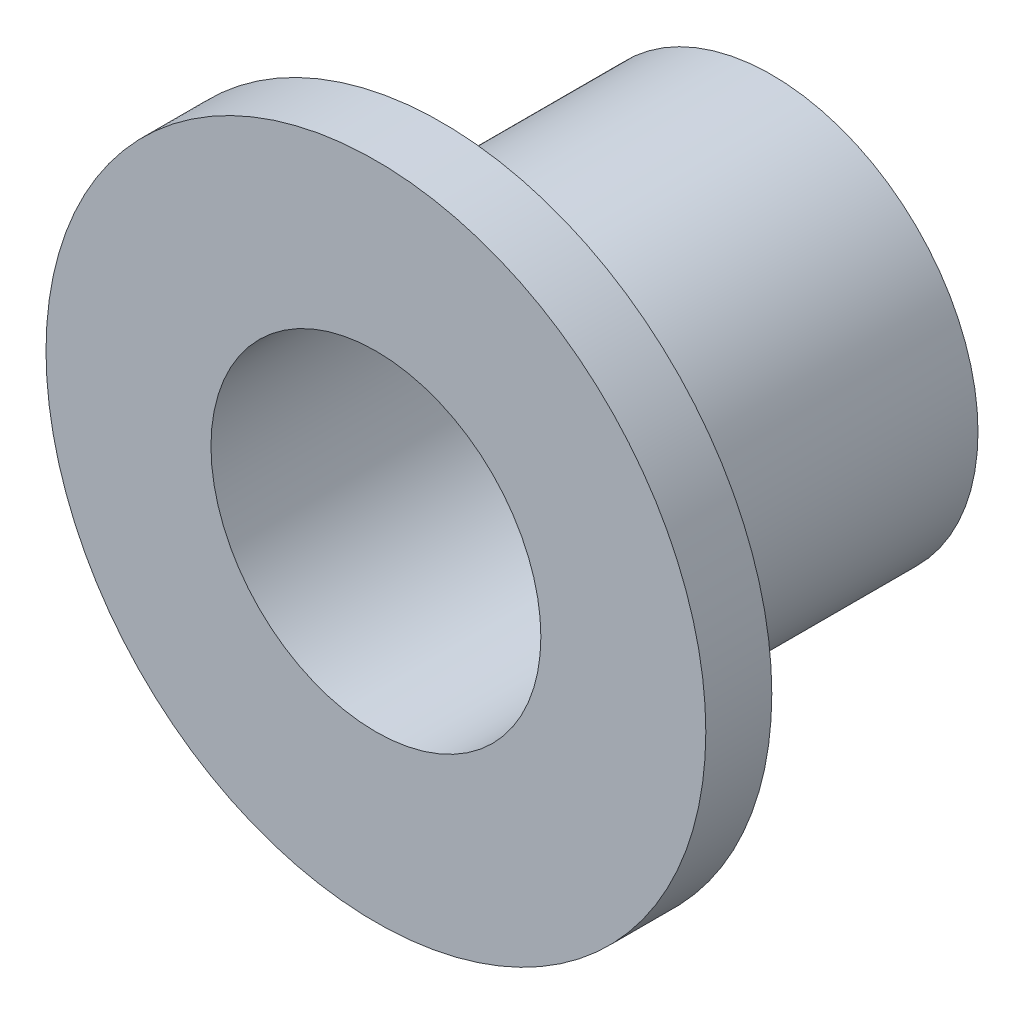
ISO-10303-21;
HEADER;
FILE_DESCRIPTION(('STEP AP214'),'2;1');
FILE_NAME('part.step','',(''),(''),'','','');
FILE_SCHEMA(('AUTOMOTIVE_DESIGN { 1 0 10303 214 1 1 1 1 }'));
ENDSEC;
DATA;
#1=APPLICATION_CONTEXT('core data for automotive mechanical design processes');
#2=APPLICATION_PROTOCOL_DEFINITION('international standard','automotive_design',2000,#1);
#3=PRODUCT_CONTEXT('',#1,'mechanical');
#4=PRODUCT('Part','Part','',(#3));
#5=PRODUCT_RELATED_PRODUCT_CATEGORY('part','',(#4));
#6=PRODUCT_DEFINITION_FORMATION('','',#4);
#7=PRODUCT_DEFINITION_CONTEXT('part definition',#1,'design');
#8=PRODUCT_DEFINITION('design','',#6,#7);
#9=PRODUCT_DEFINITION_SHAPE('','',#8);
#10=(LENGTH_UNIT() NAMED_UNIT(*) SI_UNIT(.MILLI.,.METRE.));
#11=(NAMED_UNIT(*) PLANE_ANGLE_UNIT() SI_UNIT($,.RADIAN.));
#12=(NAMED_UNIT(*) SI_UNIT($,.STERADIAN.) SOLID_ANGLE_UNIT());
#13=UNCERTAINTY_MEASURE_WITH_UNIT(LENGTH_MEASURE(1.E-05),#10,'distance_accuracy_value','');
#14=(GEOMETRIC_REPRESENTATION_CONTEXT(3) GLOBAL_UNCERTAINTY_ASSIGNED_CONTEXT((#13)) GLOBAL_UNIT_ASSIGNED_CONTEXT((#10,
#11,#12)) REPRESENTATION_CONTEXT('',''));
#15=CARTESIAN_POINT('',(0.,0.,0.));
#16=DIRECTION('',(0.,0.,1.));
#17=DIRECTION('',(1.,0.,0.));
#18=AXIS2_PLACEMENT_3D('',#15,#16,#17);
#19=CARTESIAN_POINT('',(0.,0.,0.));
#20=DIRECTION('',(0.,0.,1.));
#21=DIRECTION('',(1.,0.,0.));
#22=AXIS2_PLACEMENT_3D('',#19,#20,#21);
#23=PLANE('',#22);
#24=CARTESIAN_POINT('',(0.,0.,0.));
#25=DIRECTION('',(0.,0.,1.));
#26=DIRECTION('',(1.,0.,0.));
#27=AXIS2_PLACEMENT_3D('',#24,#25,#26);
#28=CIRCLE('',#27,3.96875);
#29=CARTESIAN_POINT('',(3.96875,0.,0.));
#30=VERTEX_POINT('',#29);
#31=EDGE_CURVE('E35',#30,#30,#28,.T.);
#32=ORIENTED_EDGE('',*,*,#31,.F.);
#33=EDGE_LOOP('',(#32));
#34=FACE_BOUND('',#33,.T.);
#35=CARTESIAN_POINT('',(0.,0.,0.));
#36=DIRECTION('',(0.,0.,1.));
#37=DIRECTION('',(1.,0.,0.));
#38=AXIS2_PLACEMENT_3D('',#35,#36,#37);
#39=CIRCLE('',#38,3.175);
#40=CARTESIAN_POINT('',(3.175,0.,0.));
#41=VERTEX_POINT('',#40);
#42=EDGE_CURVE('E42',#41,#41,#39,.T.);
#43=ORIENTED_EDGE('',*,*,#42,.T.);
#44=EDGE_LOOP('',(#43));
#45=FACE_BOUND('',#44,.T.);
#46=ADVANCED_FACE('F31',(#34,#45),#23,.F.);
#47=CARTESIAN_POINT('',(0.,0.,6.35));
#48=DIRECTION('',(0.,0.,-1.));
#49=DIRECTION('',(-1.,0.,0.));
#50=AXIS2_PLACEMENT_3D('',#47,#48,#49);
#51=CYLINDRICAL_SURFACE('',#50,3.96875);
#52=CARTESIAN_POINT('',(0.,0.,6.35));
#53=DIRECTION('',(0.,0.,1.));
#54=DIRECTION('',(1.,0.,0.));
#55=AXIS2_PLACEMENT_3D('',#52,#53,#54);
#56=CIRCLE('',#55,3.96875);
#57=CARTESIAN_POINT('',(3.96875,0.,6.35));
#58=VERTEX_POINT('',#57);
#59=EDGE_CURVE('E10',#58,#58,#56,.T.);
#60=ORIENTED_EDGE('',*,*,#59,.F.);
#61=EDGE_LOOP('',(#60));
#62=FACE_BOUND('',#61,.T.);
#63=ORIENTED_EDGE('',*,*,#31,.T.);
#64=EDGE_LOOP('',(#63));
#65=FACE_BOUND('',#64,.T.);
#66=ADVANCED_FACE('F33',(#62,#65),#51,.T.);
#67=CARTESIAN_POINT('',(0.,0.,6.35));
#68=DIRECTION('',(0.,0.,-1.));
#69=DIRECTION('',(-1.,0.,0.));
#70=AXIS2_PLACEMENT_3D('',#67,#68,#69);
#71=CYLINDRICAL_SURFACE('',#70,3.175);
#72=ORIENTED_EDGE('',*,*,#42,.F.);
#73=EDGE_LOOP('',(#72));
#74=FACE_BOUND('',#73,.T.);
#75=CARTESIAN_POINT('',(0.,0.,7.62));
#76=DIRECTION('',(0.,0.,1.));
#77=DIRECTION('',(1.,0.,0.));
#78=AXIS2_PLACEMENT_3D('',#75,#76,#77);
#79=CIRCLE('',#78,3.175);
#80=CARTESIAN_POINT('',(3.175,0.,7.62));
#81=VERTEX_POINT('',#80);
#82=EDGE_CURVE('E50',#81,#81,#79,.T.);
#83=ORIENTED_EDGE('',*,*,#82,.T.);
#84=EDGE_LOOP('',(#83));
#85=FACE_BOUND('',#84,.T.);
#86=ADVANCED_FACE('F56',(#74,#85),#71,.F.);
#87=CARTESIAN_POINT('',(0.,0.,6.35));
#88=DIRECTION('',(0.,0.,1.));
#89=DIRECTION('',(1.,0.,0.));
#90=AXIS2_PLACEMENT_3D('',#87,#88,#89);
#91=PLANE('',#90);
#92=CARTESIAN_POINT('',(0.,0.,6.35));
#93=DIRECTION('',(0.,0.,1.));
#94=DIRECTION('',(1.,0.,0.));
#95=AXIS2_PLACEMENT_3D('',#92,#93,#94);
#96=CIRCLE('',#95,6.35);
#97=CARTESIAN_POINT('',(6.35,0.,6.35));
#98=VERTEX_POINT('',#97);
#99=EDGE_CURVE('E47',#98,#98,#96,.T.);
#100=ORIENTED_EDGE('',*,*,#99,.F.);
#101=EDGE_LOOP('',(#100));
#102=FACE_BOUND('',#101,.T.);
#103=ORIENTED_EDGE('',*,*,#59,.T.);
#104=EDGE_LOOP('',(#103));
#105=FACE_BOUND('',#104,.T.);
#106=ADVANCED_FACE('F61',(#102,#105),#91,.F.);
#107=CARTESIAN_POINT('',(0.,0.,7.62));
#108=DIRECTION('',(0.,0.,1.));
#109=DIRECTION('',(1.,0.,0.));
#110=AXIS2_PLACEMENT_3D('',#107,#108,#109);
#111=PLANE('',#110);
#112=CARTESIAN_POINT('',(0.,0.,7.62));
#113=DIRECTION('',(0.,0.,1.));
#114=DIRECTION('',(1.,0.,0.));
#115=AXIS2_PLACEMENT_3D('',#112,#113,#114);
#116=CIRCLE('',#115,6.35);
#117=CARTESIAN_POINT('',(6.35,0.,7.62));
#118=VERTEX_POINT('',#117);
#119=EDGE_CURVE('E46',#118,#118,#116,.T.);
#120=ORIENTED_EDGE('',*,*,#119,.T.);
#121=EDGE_LOOP('',(#120));
#122=FACE_BOUND('',#121,.T.);
#123=ORIENTED_EDGE('',*,*,#82,.F.);
#124=EDGE_LOOP('',(#123));
#125=FACE_BOUND('',#124,.T.);
#126=ADVANCED_FACE('F58',(#122,#125),#111,.T.);
#127=CARTESIAN_POINT('',(0.,0.,7.62));
#128=DIRECTION('',(0.,0.,-1.));
#129=DIRECTION('',(-1.,0.,0.));
#130=AXIS2_PLACEMENT_3D('',#127,#128,#129);
#131=CYLINDRICAL_SURFACE('',#130,6.35);
#132=ORIENTED_EDGE('',*,*,#119,.F.);
#133=EDGE_LOOP('',(#132));
#134=FACE_BOUND('',#133,.T.);
#135=ORIENTED_EDGE('',*,*,#99,.T.);
#136=EDGE_LOOP('',(#135));
#137=FACE_BOUND('',#136,.T.);
#138=ADVANCED_FACE('F60',(#134,#137),#131,.T.);
#139=CLOSED_SHELL('',(#46,#66,#86,#106,#126,#138));
#140=MANIFOLD_SOLID_BREP('B2',#139);
#141=ADVANCED_BREP_SHAPE_REPRESENTATION('',(#18,#140),#14);
#142=SHAPE_DEFINITION_REPRESENTATION(#9,#141);
ENDSEC;
END-ISO-10303-21;
